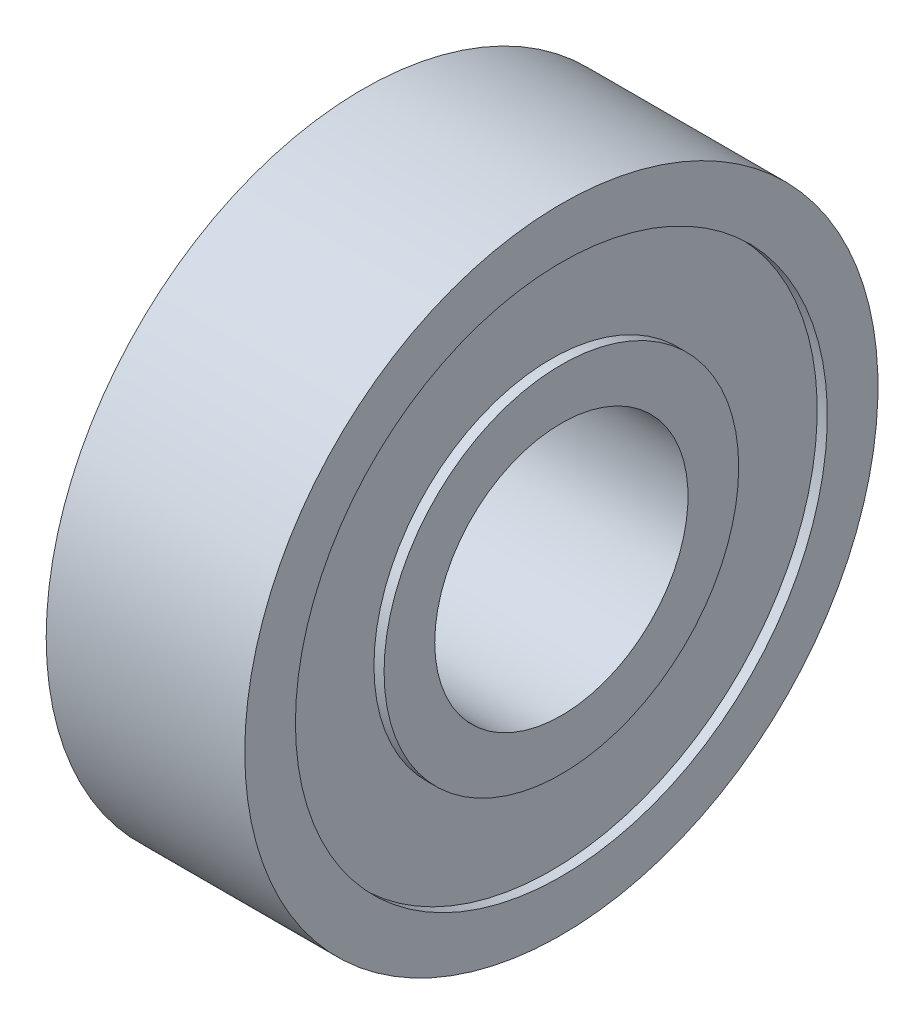
ISO-10303-21;
HEADER;
FILE_DESCRIPTION(('STEP AP214'),'2;1');
FILE_NAME('part.step','',(''),(''),'','','');
FILE_SCHEMA(('AUTOMOTIVE_DESIGN { 1 0 10303 214 1 1 1 1 }'));
ENDSEC;
DATA;
#1=APPLICATION_CONTEXT('core data for automotive mechanical design processes');
#2=APPLICATION_PROTOCOL_DEFINITION('international standard','automotive_design',2000,#1);
#3=PRODUCT_CONTEXT('',#1,'mechanical');
#4=PRODUCT('Part','Part','',(#3));
#5=PRODUCT_RELATED_PRODUCT_CATEGORY('part','',(#4));
#6=PRODUCT_DEFINITION_FORMATION('','',#4);
#7=PRODUCT_DEFINITION_CONTEXT('part definition',#1,'design');
#8=PRODUCT_DEFINITION('design','',#6,#7);
#9=PRODUCT_DEFINITION_SHAPE('','',#8);
#10=(LENGTH_UNIT() NAMED_UNIT(*) SI_UNIT(.MILLI.,.METRE.));
#11=(NAMED_UNIT(*) PLANE_ANGLE_UNIT() SI_UNIT($,.RADIAN.));
#12=(NAMED_UNIT(*) SI_UNIT($,.STERADIAN.) SOLID_ANGLE_UNIT());
#13=UNCERTAINTY_MEASURE_WITH_UNIT(LENGTH_MEASURE(1.E-05),#10,'distance_accuracy_value','');
#14=(GEOMETRIC_REPRESENTATION_CONTEXT(3) GLOBAL_UNCERTAINTY_ASSIGNED_CONTEXT((#13)) GLOBAL_UNIT_ASSIGNED_CONTEXT((#10,
#11,#12)) REPRESENTATION_CONTEXT('',''));
#15=CARTESIAN_POINT('',(0.,0.,0.));
#16=DIRECTION('',(0.,0.,1.));
#17=DIRECTION('',(1.,0.,0.));
#18=AXIS2_PLACEMENT_3D('',#15,#16,#17);
#19=CARTESIAN_POINT('',(-2.4892,0.,0.));
#20=DIRECTION('',(1.,0.,0.));
#21=DIRECTION('',(0.,0.,1.));
#22=AXIS2_PLACEMENT_3D('',#19,#20,#21);
#23=PLANE('',#22);
#24=CARTESIAN_POINT('',(-2.4892,0.,0.));
#25=DIRECTION('',(-1.,0.,0.));
#26=DIRECTION('',(0.,0.,1.));
#27=AXIS2_PLACEMENT_3D('',#24,#25,#26);
#28=CIRCLE('',#27,3.175);
#29=CARTESIAN_POINT('',(-2.4892,0.,3.175));
#30=VERTEX_POINT('',#29);
#31=EDGE_CURVE('E54',#30,#30,#28,.T.);
#32=ORIENTED_EDGE('',*,*,#31,.F.);
#33=EDGE_LOOP('',(#32));
#34=FACE_BOUND('',#33,.T.);
#35=CARTESIAN_POINT('',(-2.4892,0.,0.));
#36=DIRECTION('',(-1.,0.,0.));
#37=DIRECTION('',(0.,0.,1.));
#38=AXIS2_PLACEMENT_3D('',#35,#36,#37);
#39=CIRCLE('',#38,4.445);
#40=CARTESIAN_POINT('',(-2.4892,0.,4.445));
#41=VERTEX_POINT('',#40);
#42=EDGE_CURVE('E78',#41,#41,#39,.T.);
#43=ORIENTED_EDGE('',*,*,#42,.T.);
#44=EDGE_LOOP('',(#43));
#45=FACE_BOUND('',#44,.T.);
#46=ADVANCED_FACE('F41',(#34,#45),#23,.F.);
#47=CARTESIAN_POINT('',(2.4892,0.,0.));
#48=DIRECTION('',(1.,0.,0.));
#49=DIRECTION('',(0.,0.,1.));
#50=AXIS2_PLACEMENT_3D('',#47,#48,#49);
#51=PLANE('',#50);
#52=CARTESIAN_POINT('',(2.4892,0.,0.));
#53=DIRECTION('',(-1.,0.,0.));
#54=DIRECTION('',(0.,0.,1.));
#55=AXIS2_PLACEMENT_3D('',#52,#53,#54);
#56=CIRCLE('',#55,3.175);
#57=CARTESIAN_POINT('',(2.4892,0.,3.175));
#58=VERTEX_POINT('',#57);
#59=EDGE_CURVE('E52',#58,#58,#56,.T.);
#60=ORIENTED_EDGE('',*,*,#59,.T.);
#61=EDGE_LOOP('',(#60));
#62=FACE_BOUND('',#61,.T.);
#63=CARTESIAN_POINT('',(2.4892,0.,0.));
#64=DIRECTION('',(-1.,0.,0.));
#65=DIRECTION('',(0.,0.,1.));
#66=AXIS2_PLACEMENT_3D('',#63,#64,#65);
#67=CIRCLE('',#66,4.445);
#68=CARTESIAN_POINT('',(2.4892,0.,4.445));
#69=VERTEX_POINT('',#68);
#70=EDGE_CURVE('E66',#69,#69,#67,.T.);
#71=ORIENTED_EDGE('',*,*,#70,.F.);
#72=EDGE_LOOP('',(#71));
#73=FACE_BOUND('',#72,.T.);
#74=ADVANCED_FACE('F104',(#62,#73),#51,.T.);
#75=CARTESIAN_POINT('',(2.4892,0.,0.));
#76=DIRECTION('',(-1.,0.,0.));
#77=DIRECTION('',(0.,0.,1.));
#78=AXIS2_PLACEMENT_3D('',#75,#76,#77);
#79=CIRCLE('',#78,6.6675);
#80=CARTESIAN_POINT('',(2.4892,0.,6.6675));
#81=VERTEX_POINT('',#80);
#82=EDGE_CURVE('E60',#81,#81,#79,.T.);
#83=ORIENTED_EDGE('',*,*,#82,.T.);
#84=EDGE_LOOP('',(#83));
#85=FACE_BOUND('',#84,.T.);
#86=CARTESIAN_POINT('',(2.4892,0.,0.));
#87=DIRECTION('',(-1.,0.,0.));
#88=DIRECTION('',(0.,0.,1.));
#89=AXIS2_PLACEMENT_3D('',#86,#87,#88);
#90=CIRCLE('',#89,7.9375);
#91=CARTESIAN_POINT('',(2.4892,0.,7.9375));
#92=VERTEX_POINT('',#91);
#93=EDGE_CURVE('E10',#92,#92,#90,.T.);
#94=ORIENTED_EDGE('',*,*,#93,.F.);
#95=EDGE_LOOP('',(#94));
#96=FACE_BOUND('',#95,.T.);
#97=ADVANCED_FACE('F110',(#85,#96),#51,.T.);
#98=CARTESIAN_POINT('',(-2.4892,0.,0.));
#99=DIRECTION('',(-1.,0.,0.));
#100=DIRECTION('',(0.,0.,1.));
#101=AXIS2_PLACEMENT_3D('',#98,#99,#100);
#102=CIRCLE('',#101,6.6675);
#103=CARTESIAN_POINT('',(-2.4892,0.,6.6675));
#104=VERTEX_POINT('',#103);
#105=EDGE_CURVE('E72',#104,#104,#102,.T.);
#106=ORIENTED_EDGE('',*,*,#105,.F.);
#107=EDGE_LOOP('',(#106));
#108=FACE_BOUND('',#107,.T.);
#109=CARTESIAN_POINT('',(-2.4892,0.,0.));
#110=DIRECTION('',(-1.,0.,0.));
#111=DIRECTION('',(0.,0.,1.));
#112=AXIS2_PLACEMENT_3D('',#109,#110,#111);
#113=CIRCLE('',#112,7.9375);
#114=CARTESIAN_POINT('',(-2.4892,0.,7.9375));
#115=VERTEX_POINT('',#114);
#116=EDGE_CURVE('E45',#115,#115,#113,.T.);
#117=ORIENTED_EDGE('',*,*,#116,.T.);
#118=EDGE_LOOP('',(#117));
#119=FACE_BOUND('',#118,.T.);
#120=ADVANCED_FACE('F106',(#108,#119),#23,.F.);
#121=CARTESIAN_POINT('',(2.4892,0.,0.));
#122=DIRECTION('',(-1.,0.,0.));
#123=DIRECTION('',(0.,0.,-1.));
#124=AXIS2_PLACEMENT_3D('',#121,#122,#123);
#125=CYLINDRICAL_SURFACE('',#124,7.9375);
#126=ORIENTED_EDGE('',*,*,#93,.T.);
#127=EDGE_LOOP('',(#126));
#128=FACE_BOUND('',#127,.T.);
#129=ORIENTED_EDGE('',*,*,#116,.F.);
#130=EDGE_LOOP('',(#129));
#131=FACE_BOUND('',#130,.T.);
#132=ADVANCED_FACE('F43',(#128,#131),#125,.T.);
#133=CARTESIAN_POINT('',(2.4892,0.,0.));
#134=DIRECTION('',(-1.,0.,0.));
#135=DIRECTION('',(0.,0.,-1.));
#136=AXIS2_PLACEMENT_3D('',#133,#134,#135);
#137=CYLINDRICAL_SURFACE('',#136,3.175);
#138=ORIENTED_EDGE('',*,*,#59,.F.);
#139=EDGE_LOOP('',(#138));
#140=FACE_BOUND('',#139,.T.);
#141=ORIENTED_EDGE('',*,*,#31,.T.);
#142=EDGE_LOOP('',(#141));
#143=FACE_BOUND('',#142,.T.);
#144=ADVANCED_FACE('F121',(#140,#143),#137,.F.);
#145=CARTESIAN_POINT('',(2.2352,0.,0.));
#146=DIRECTION('',(1.,0.,0.));
#147=DIRECTION('',(0.,0.,1.));
#148=AXIS2_PLACEMENT_3D('',#145,#146,#147);
#149=CYLINDRICAL_SURFACE('',#148,6.6675);
#150=CARTESIAN_POINT('',(2.2352,0.,0.));
#151=DIRECTION('',(-1.,0.,0.));
#152=DIRECTION('',(0.,0.,1.));
#153=AXIS2_PLACEMENT_3D('',#150,#151,#152);
#154=CIRCLE('',#153,6.6675);
#155=CARTESIAN_POINT('',(2.2352,0.,6.6675));
#156=VERTEX_POINT('',#155);
#157=EDGE_CURVE('E57',#156,#156,#154,.T.);
#158=ORIENTED_EDGE('',*,*,#157,.T.);
#159=EDGE_LOOP('',(#158));
#160=FACE_BOUND('',#159,.T.);
#161=ORIENTED_EDGE('',*,*,#82,.F.);
#162=EDGE_LOOP('',(#161));
#163=FACE_BOUND('',#162,.T.);
#164=ADVANCED_FACE('F134',(#160,#163),#149,.F.);
#165=CARTESIAN_POINT('',(2.2352,0.,0.));
#166=DIRECTION('',(1.,0.,0.));
#167=DIRECTION('',(0.,0.,1.));
#168=AXIS2_PLACEMENT_3D('',#165,#166,#167);
#169=PLANE('',#168);
#170=CARTESIAN_POINT('',(2.2352,0.,0.));
#171=DIRECTION('',(-1.,0.,0.));
#172=DIRECTION('',(0.,0.,1.));
#173=AXIS2_PLACEMENT_3D('',#170,#171,#172);
#174=CIRCLE('',#173,4.445);
#175=CARTESIAN_POINT('',(2.2352,0.,4.445));
#176=VERTEX_POINT('',#175);
#177=EDGE_CURVE('E63',#176,#176,#174,.T.);
#178=ORIENTED_EDGE('',*,*,#177,.T.);
#179=EDGE_LOOP('',(#178));
#180=FACE_BOUND('',#179,.T.);
#181=ORIENTED_EDGE('',*,*,#157,.F.);
#182=EDGE_LOOP('',(#181));
#183=FACE_BOUND('',#182,.T.);
#184=ADVANCED_FACE('F99',(#180,#183),#169,.T.);
#185=CARTESIAN_POINT('',(2.2352,0.,0.));
#186=DIRECTION('',(1.,0.,0.));
#187=DIRECTION('',(0.,0.,1.));
#188=AXIS2_PLACEMENT_3D('',#185,#186,#187);
#189=CYLINDRICAL_SURFACE('',#188,4.445);
#190=ORIENTED_EDGE('',*,*,#177,.F.);
#191=EDGE_LOOP('',(#190));
#192=FACE_BOUND('',#191,.T.);
#193=ORIENTED_EDGE('',*,*,#70,.T.);
#194=EDGE_LOOP('',(#193));
#195=FACE_BOUND('',#194,.T.);
#196=ADVANCED_FACE('F90',(#192,#195),#189,.T.);
#197=CARTESIAN_POINT('',(-2.2352,0.,0.));
#198=DIRECTION('',(-1.,0.,0.));
#199=DIRECTION('',(0.,0.,1.));
#200=AXIS2_PLACEMENT_3D('',#197,#198,#199);
#201=PLANE('',#200);
#202=CARTESIAN_POINT('',(-2.2352,0.,0.));
#203=DIRECTION('',(-1.,0.,0.));
#204=DIRECTION('',(0.,0.,1.));
#205=AXIS2_PLACEMENT_3D('',#202,#203,#204);
#206=CIRCLE('',#205,6.6675);
#207=CARTESIAN_POINT('',(-2.2352,0.,6.6675));
#208=VERTEX_POINT('',#207);
#209=EDGE_CURVE('E69',#208,#208,#206,.T.);
#210=ORIENTED_EDGE('',*,*,#209,.T.);
#211=EDGE_LOOP('',(#210));
#212=FACE_BOUND('',#211,.T.);
#213=CARTESIAN_POINT('',(-2.2352,0.,0.));
#214=DIRECTION('',(-1.,0.,0.));
#215=DIRECTION('',(0.,0.,1.));
#216=AXIS2_PLACEMENT_3D('',#213,#214,#215);
#217=CIRCLE('',#216,4.445);
#218=CARTESIAN_POINT('',(-2.2352,0.,4.445));
#219=VERTEX_POINT('',#218);
#220=EDGE_CURVE('E75',#219,#219,#217,.T.);
#221=ORIENTED_EDGE('',*,*,#220,.F.);
#222=EDGE_LOOP('',(#221));
#223=FACE_BOUND('',#222,.T.);
#224=ADVANCED_FACE('F87',(#212,#223),#201,.T.);
#225=CARTESIAN_POINT('',(-2.2352,0.,0.));
#226=DIRECTION('',(-1.,0.,0.));
#227=DIRECTION('',(0.,0.,-1.));
#228=AXIS2_PLACEMENT_3D('',#225,#226,#227);
#229=CYLINDRICAL_SURFACE('',#228,6.6675);
#230=ORIENTED_EDGE('',*,*,#209,.F.);
#231=EDGE_LOOP('',(#230));
#232=FACE_BOUND('',#231,.T.);
#233=ORIENTED_EDGE('',*,*,#105,.T.);
#234=EDGE_LOOP('',(#233));
#235=FACE_BOUND('',#234,.T.);
#236=ADVANCED_FACE('F89',(#232,#235),#229,.F.);
#237=CARTESIAN_POINT('',(-2.2352,0.,0.));
#238=DIRECTION('',(-1.,0.,0.));
#239=DIRECTION('',(0.,0.,-1.));
#240=AXIS2_PLACEMENT_3D('',#237,#238,#239);
#241=CYLINDRICAL_SURFACE('',#240,4.445);
#242=ORIENTED_EDGE('',*,*,#220,.T.);
#243=EDGE_LOOP('',(#242));
#244=FACE_BOUND('',#243,.T.);
#245=ORIENTED_EDGE('',*,*,#42,.F.);
#246=EDGE_LOOP('',(#245));
#247=FACE_BOUND('',#246,.T.);
#248=ADVANCED_FACE('F84',(#244,#247),#241,.T.);
#249=CLOSED_SHELL('',(#46,#74,#97,#120,#132,#144,#164,#184,#196,#224,#236,#248));
#250=MANIFOLD_SOLID_BREP('B2',#249);
#251=ADVANCED_BREP_SHAPE_REPRESENTATION('',(#18,#250),#14);
#252=SHAPE_DEFINITION_REPRESENTATION(#9,#251);
ENDSEC;
END-ISO-10303-21;
